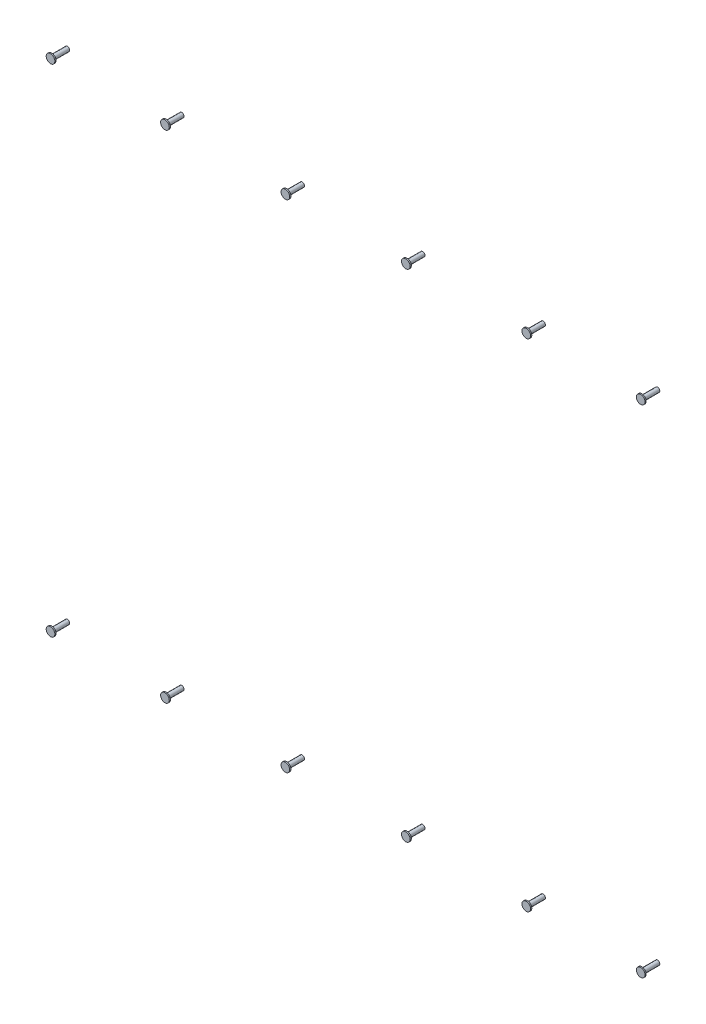
ISO-10303-21;
HEADER;
FILE_DESCRIPTION(('STEP AP214'),'2;1');
FILE_NAME('part.step','',(''),(''),'','','');
FILE_SCHEMA(('AUTOMOTIVE_DESIGN { 1 0 10303 214 1 1 1 1 }'));
ENDSEC;
DATA;
#1=APPLICATION_CONTEXT('core data for automotive mechanical design processes');
#2=APPLICATION_PROTOCOL_DEFINITION('international standard','automotive_design',2000,#1);
#3=PRODUCT_CONTEXT('',#1,'mechanical');
#4=PRODUCT('Part','Part','',(#3));
#5=PRODUCT_RELATED_PRODUCT_CATEGORY('part','',(#4));
#6=PRODUCT_DEFINITION_FORMATION('','',#4);
#7=PRODUCT_DEFINITION_CONTEXT('part definition',#1,'design');
#8=PRODUCT_DEFINITION('design','',#6,#7);
#9=PRODUCT_DEFINITION_SHAPE('','',#8);
#10=(LENGTH_UNIT() NAMED_UNIT(*) SI_UNIT(.MILLI.,.METRE.));
#11=(NAMED_UNIT(*) PLANE_ANGLE_UNIT() SI_UNIT($,.RADIAN.));
#12=(NAMED_UNIT(*) SI_UNIT($,.STERADIAN.) SOLID_ANGLE_UNIT());
#13=UNCERTAINTY_MEASURE_WITH_UNIT(LENGTH_MEASURE(1.E-05),#10,'distance_accuracy_value','');
#14=(GEOMETRIC_REPRESENTATION_CONTEXT(3) GLOBAL_UNCERTAINTY_ASSIGNED_CONTEXT((#13)) GLOBAL_UNIT_ASSIGNED_CONTEXT((#10,
#11,#12)) REPRESENTATION_CONTEXT('',''));
#15=CARTESIAN_POINT('',(0.,0.,0.));
#16=DIRECTION('',(0.,0.,1.));
#17=DIRECTION('',(1.,0.,0.));
#18=AXIS2_PLACEMENT_3D('',#15,#16,#17);
#19=CARTESIAN_POINT('',(-245.,-206.,97.));
#20=DIRECTION('',(0.,0.,-1.));
#21=DIRECTION('',(-1.,0.,0.));
#22=AXIS2_PLACEMENT_3D('',#19,#20,#21);
#23=PLANE('',#22);
#24=CARTESIAN_POINT('',(-245.,-206.,97.));
#25=DIRECTION('',(0.,0.,1.));
#26=DIRECTION('',(1.,0.,0.));
#27=AXIS2_PLACEMENT_3D('',#24,#25,#26);
#28=CIRCLE('',#27,1.9);
#29=CARTESIAN_POINT('',(-243.1,-206.,97.));
#30=VERTEX_POINT('',#29);
#31=EDGE_CURVE('P0_E10',#30,#30,#28,.T.);
#32=ORIENTED_EDGE('',*,*,#31,.F.);
#33=EDGE_LOOP('',(#32));
#34=FACE_BOUND('',#33,.T.);
#35=ADVANCED_FACE('P0_F15',(#34),#23,.T.);
#36=CARTESIAN_POINT('',(-245.,-206.,110.));
#37=DIRECTION('',(0.,0.,-1.));
#38=DIRECTION('',(-1.,0.,0.));
#39=AXIS2_PLACEMENT_3D('',#36,#37,#38);
#40=CYLINDRICAL_SURFACE('',#39,1.9);
#41=ORIENTED_EDGE('',*,*,#31,.T.);
#42=EDGE_LOOP('',(#41));
#43=FACE_BOUND('',#42,.T.);
#44=CARTESIAN_POINT('',(-245.,-206.,110.));
#45=DIRECTION('',(0.,0.,-1.));
#46=DIRECTION('',(-1.,0.,0.));
#47=AXIS2_PLACEMENT_3D('',#44,#45,#46);
#48=CIRCLE('',#47,1.9);
#49=CARTESIAN_POINT('',(-246.9,-206.,110.));
#50=VERTEX_POINT('',#49);
#51=EDGE_CURVE('P0_E23',#50,#50,#48,.F.);
#52=ORIENTED_EDGE('',*,*,#51,.F.);
#53=EDGE_LOOP('',(#52));
#54=FACE_BOUND('',#53,.T.);
#55=ADVANCED_FACE('P0_F17',(#43,#54),#40,.T.);
#56=CARTESIAN_POINT('',(-245.,-206.,111.));
#57=DIRECTION('',(0.,0.,1.));
#58=DIRECTION('',(1.,0.,0.));
#59=AXIS2_PLACEMENT_3D('',#56,#57,#58);
#60=PLANE('',#59);
#61=CARTESIAN_POINT('',(-245.,-206.,111.));
#62=DIRECTION('',(0.,0.,-1.));
#63=DIRECTION('',(-1.,0.,0.));
#64=AXIS2_PLACEMENT_3D('',#61,#62,#63);
#65=CIRCLE('',#64,3.6);
#66=CARTESIAN_POINT('',(-248.6,-206.,111.));
#67=VERTEX_POINT('',#66);
#68=EDGE_CURVE('P0_E30',#67,#67,#65,.T.);
#69=ORIENTED_EDGE('',*,*,#68,.F.);
#70=EDGE_LOOP('',(#69));
#71=FACE_BOUND('',#70,.T.);
#72=ADVANCED_FACE('P0_F45',(#71),#60,.T.);
#73=CARTESIAN_POINT('',(-245.,-206.,110.));
#74=DIRECTION('',(0.,0.,-1.));
#75=DIRECTION('',(-1.,0.,0.));
#76=AXIS2_PLACEMENT_3D('',#73,#74,#75);
#77=PLANE('',#76);
#78=ORIENTED_EDGE('',*,*,#51,.T.);
#79=EDGE_LOOP('',(#78));
#80=FACE_BOUND('',#79,.T.);
#81=CARTESIAN_POINT('',(-245.,-206.,110.));
#82=DIRECTION('',(0.,0.,1.));
#83=DIRECTION('',(1.,0.,0.));
#84=AXIS2_PLACEMENT_3D('',#81,#82,#83);
#85=CIRCLE('',#84,3.6);
#86=CARTESIAN_POINT('',(-241.4,-206.,110.));
#87=VERTEX_POINT('',#86);
#88=EDGE_CURVE('P0_E35',#87,#87,#85,.T.);
#89=ORIENTED_EDGE('',*,*,#88,.F.);
#90=EDGE_LOOP('',(#89));
#91=FACE_BOUND('',#90,.T.);
#92=ADVANCED_FACE('P0_F43',(#80,#91),#77,.T.);
#93=CARTESIAN_POINT('',(-245.,-206.,110.));
#94=DIRECTION('',(0.,0.,1.));
#95=DIRECTION('',(1.,0.,0.));
#96=AXIS2_PLACEMENT_3D('',#93,#94,#95);
#97=CYLINDRICAL_SURFACE('',#96,3.6);
#98=ORIENTED_EDGE('',*,*,#68,.T.);
#99=EDGE_LOOP('',(#98));
#100=FACE_BOUND('',#99,.T.);
#101=ORIENTED_EDGE('',*,*,#88,.T.);
#102=EDGE_LOOP('',(#101));
#103=FACE_BOUND('',#102,.T.);
#104=ADVANCED_FACE('P0_F41',(#100,#103),#97,.T.);
#105=CLOSED_SHELL('',(#35,#55,#72,#92,#104));
#106=MANIFOLD_SOLID_BREP('P0_B1',#105);
#107=CARTESIAN_POINT('',(150.,206.,97.));
#108=DIRECTION('',(0.,0.,-1.));
#109=DIRECTION('',(-1.,0.,0.));
#110=AXIS2_PLACEMENT_3D('',#107,#108,#109);
#111=PLANE('',#110);
#112=CARTESIAN_POINT('',(150.,206.,97.));
#113=DIRECTION('',(0.,0.,1.));
#114=DIRECTION('',(1.,0.,0.));
#115=AXIS2_PLACEMENT_3D('',#112,#113,#114);
#116=CIRCLE('',#115,1.9);
#117=CARTESIAN_POINT('',(151.9,206.,97.));
#118=VERTEX_POINT('',#117);
#119=EDGE_CURVE('P1_E10',#118,#118,#116,.T.);
#120=ORIENTED_EDGE('',*,*,#119,.F.);
#121=EDGE_LOOP('',(#120));
#122=FACE_BOUND('',#121,.T.);
#123=ADVANCED_FACE('P1_F15',(#122),#111,.T.);
#124=CARTESIAN_POINT('',(150.,206.,110.));
#125=DIRECTION('',(0.,0.,-1.));
#126=DIRECTION('',(-1.,0.,0.));
#127=AXIS2_PLACEMENT_3D('',#124,#125,#126);
#128=CYLINDRICAL_SURFACE('',#127,1.9);
#129=ORIENTED_EDGE('',*,*,#119,.T.);
#130=EDGE_LOOP('',(#129));
#131=FACE_BOUND('',#130,.T.);
#132=CARTESIAN_POINT('',(150.,206.,110.));
#133=DIRECTION('',(0.,0.,-1.));
#134=DIRECTION('',(-1.,0.,0.));
#135=AXIS2_PLACEMENT_3D('',#132,#133,#134);
#136=CIRCLE('',#135,1.9);
#137=CARTESIAN_POINT('',(148.1,206.,110.));
#138=VERTEX_POINT('',#137);
#139=EDGE_CURVE('P1_E23',#138,#138,#136,.F.);
#140=ORIENTED_EDGE('',*,*,#139,.F.);
#141=EDGE_LOOP('',(#140));
#142=FACE_BOUND('',#141,.T.);
#143=ADVANCED_FACE('P1_F17',(#131,#142),#128,.T.);
#144=CARTESIAN_POINT('',(150.,206.,111.));
#145=DIRECTION('',(0.,0.,1.));
#146=DIRECTION('',(1.,0.,0.));
#147=AXIS2_PLACEMENT_3D('',#144,#145,#146);
#148=PLANE('',#147);
#149=CARTESIAN_POINT('',(150.,206.,111.));
#150=DIRECTION('',(0.,0.,-1.));
#151=DIRECTION('',(-1.,0.,0.));
#152=AXIS2_PLACEMENT_3D('',#149,#150,#151);
#153=CIRCLE('',#152,3.6);
#154=CARTESIAN_POINT('',(146.4,206.,111.));
#155=VERTEX_POINT('',#154);
#156=EDGE_CURVE('P1_E30',#155,#155,#153,.T.);
#157=ORIENTED_EDGE('',*,*,#156,.F.);
#158=EDGE_LOOP('',(#157));
#159=FACE_BOUND('',#158,.T.);
#160=ADVANCED_FACE('P1_F45',(#159),#148,.T.);
#161=CARTESIAN_POINT('',(150.,206.,110.));
#162=DIRECTION('',(0.,0.,-1.));
#163=DIRECTION('',(-1.,0.,0.));
#164=AXIS2_PLACEMENT_3D('',#161,#162,#163);
#165=PLANE('',#164);
#166=ORIENTED_EDGE('',*,*,#139,.T.);
#167=EDGE_LOOP('',(#166));
#168=FACE_BOUND('',#167,.T.);
#169=CARTESIAN_POINT('',(150.,206.,110.));
#170=DIRECTION('',(0.,0.,1.));
#171=DIRECTION('',(1.,0.,0.));
#172=AXIS2_PLACEMENT_3D('',#169,#170,#171);
#173=CIRCLE('',#172,3.6);
#174=CARTESIAN_POINT('',(153.6,206.,110.));
#175=VERTEX_POINT('',#174);
#176=EDGE_CURVE('P1_E34',#175,#175,#173,.T.);
#177=ORIENTED_EDGE('',*,*,#176,.F.);
#178=EDGE_LOOP('',(#177));
#179=FACE_BOUND('',#178,.T.);
#180=ADVANCED_FACE('P1_F43',(#168,#179),#165,.T.);
#181=CARTESIAN_POINT('',(150.,206.,110.));
#182=DIRECTION('',(0.,0.,1.));
#183=DIRECTION('',(1.,0.,0.));
#184=AXIS2_PLACEMENT_3D('',#181,#182,#183);
#185=CYLINDRICAL_SURFACE('',#184,3.6);
#186=ORIENTED_EDGE('',*,*,#156,.T.);
#187=EDGE_LOOP('',(#186));
#188=FACE_BOUND('',#187,.T.);
#189=ORIENTED_EDGE('',*,*,#176,.T.);
#190=EDGE_LOOP('',(#189));
#191=FACE_BOUND('',#190,.T.);
#192=ADVANCED_FACE('P1_F41',(#188,#191),#185,.T.);
#193=CLOSED_SHELL('',(#123,#143,#160,#180,#192));
#194=MANIFOLD_SOLID_BREP('P1_B1',#193);
#195=CARTESIAN_POINT('',(245.,-206.,97.));
#196=DIRECTION('',(0.,0.,-1.));
#197=DIRECTION('',(-1.,0.,0.));
#198=AXIS2_PLACEMENT_3D('',#195,#196,#197);
#199=PLANE('',#198);
#200=CARTESIAN_POINT('',(245.,-206.,97.));
#201=DIRECTION('',(0.,0.,1.));
#202=DIRECTION('',(1.,0.,0.));
#203=AXIS2_PLACEMENT_3D('',#200,#201,#202);
#204=CIRCLE('',#203,1.9);
#205=CARTESIAN_POINT('',(246.9,-206.,97.));
#206=VERTEX_POINT('',#205);
#207=EDGE_CURVE('P2_E10',#206,#206,#204,.T.);
#208=ORIENTED_EDGE('',*,*,#207,.F.);
#209=EDGE_LOOP('',(#208));
#210=FACE_BOUND('',#209,.T.);
#211=ADVANCED_FACE('P2_F15',(#210),#199,.T.);
#212=CARTESIAN_POINT('',(245.,-206.,110.));
#213=DIRECTION('',(0.,0.,-1.));
#214=DIRECTION('',(-1.,0.,0.));
#215=AXIS2_PLACEMENT_3D('',#212,#213,#214);
#216=CYLINDRICAL_SURFACE('',#215,1.9);
#217=ORIENTED_EDGE('',*,*,#207,.T.);
#218=EDGE_LOOP('',(#217));
#219=FACE_BOUND('',#218,.T.);
#220=CARTESIAN_POINT('',(245.,-206.,110.));
#221=DIRECTION('',(0.,0.,-1.));
#222=DIRECTION('',(-1.,0.,0.));
#223=AXIS2_PLACEMENT_3D('',#220,#221,#222);
#224=CIRCLE('',#223,1.9);
#225=CARTESIAN_POINT('',(243.1,-206.,110.));
#226=VERTEX_POINT('',#225);
#227=EDGE_CURVE('P2_E23',#226,#226,#224,.F.);
#228=ORIENTED_EDGE('',*,*,#227,.F.);
#229=EDGE_LOOP('',(#228));
#230=FACE_BOUND('',#229,.T.);
#231=ADVANCED_FACE('P2_F17',(#219,#230),#216,.T.);
#232=CARTESIAN_POINT('',(245.,-206.,111.));
#233=DIRECTION('',(0.,0.,1.));
#234=DIRECTION('',(1.,0.,0.));
#235=AXIS2_PLACEMENT_3D('',#232,#233,#234);
#236=PLANE('',#235);
#237=CARTESIAN_POINT('',(245.,-206.,111.));
#238=DIRECTION('',(0.,0.,-1.));
#239=DIRECTION('',(-1.,0.,0.));
#240=AXIS2_PLACEMENT_3D('',#237,#238,#239);
#241=CIRCLE('',#240,3.6);
#242=CARTESIAN_POINT('',(241.4,-206.,111.));
#243=VERTEX_POINT('',#242);
#244=EDGE_CURVE('P2_E30',#243,#243,#241,.T.);
#245=ORIENTED_EDGE('',*,*,#244,.F.);
#246=EDGE_LOOP('',(#245));
#247=FACE_BOUND('',#246,.T.);
#248=ADVANCED_FACE('P2_F45',(#247),#236,.T.);
#249=CARTESIAN_POINT('',(245.,-206.,110.));
#250=DIRECTION('',(0.,0.,-1.));
#251=DIRECTION('',(-1.,0.,0.));
#252=AXIS2_PLACEMENT_3D('',#249,#250,#251);
#253=PLANE('',#252);
#254=ORIENTED_EDGE('',*,*,#227,.T.);
#255=EDGE_LOOP('',(#254));
#256=FACE_BOUND('',#255,.T.);
#257=CARTESIAN_POINT('',(245.,-206.,110.));
#258=DIRECTION('',(0.,0.,1.));
#259=DIRECTION('',(1.,0.,0.));
#260=AXIS2_PLACEMENT_3D('',#257,#258,#259);
#261=CIRCLE('',#260,3.6);
#262=CARTESIAN_POINT('',(248.6,-206.,110.));
#263=VERTEX_POINT('',#262);
#264=EDGE_CURVE('P2_E35',#263,#263,#261,.T.);
#265=ORIENTED_EDGE('',*,*,#264,.F.);
#266=EDGE_LOOP('',(#265));
#267=FACE_BOUND('',#266,.T.);
#268=ADVANCED_FACE('P2_F43',(#256,#267),#253,.T.);
#269=CARTESIAN_POINT('',(245.,-206.,110.));
#270=DIRECTION('',(0.,0.,1.));
#271=DIRECTION('',(1.,0.,0.));
#272=AXIS2_PLACEMENT_3D('',#269,#270,#271);
#273=CYLINDRICAL_SURFACE('',#272,3.6);
#274=ORIENTED_EDGE('',*,*,#244,.T.);
#275=EDGE_LOOP('',(#274));
#276=FACE_BOUND('',#275,.T.);
#277=ORIENTED_EDGE('',*,*,#264,.T.);
#278=EDGE_LOOP('',(#277));
#279=FACE_BOUND('',#278,.T.);
#280=ADVANCED_FACE('P2_F41',(#276,#279),#273,.T.);
#281=CLOSED_SHELL('',(#211,#231,#248,#268,#280));
#282=MANIFOLD_SOLID_BREP('P2_B1',#281);
#283=CARTESIAN_POINT('',(245.,206.,97.));
#284=DIRECTION('',(0.,0.,-1.));
#285=DIRECTION('',(-1.,0.,0.));
#286=AXIS2_PLACEMENT_3D('',#283,#284,#285);
#287=PLANE('',#286);
#288=CARTESIAN_POINT('',(245.,206.,97.));
#289=DIRECTION('',(0.,0.,1.));
#290=DIRECTION('',(1.,0.,0.));
#291=AXIS2_PLACEMENT_3D('',#288,#289,#290);
#292=CIRCLE('',#291,1.9);
#293=CARTESIAN_POINT('',(246.9,206.,97.));
#294=VERTEX_POINT('',#293);
#295=EDGE_CURVE('P3_E10',#294,#294,#292,.T.);
#296=ORIENTED_EDGE('',*,*,#295,.F.);
#297=EDGE_LOOP('',(#296));
#298=FACE_BOUND('',#297,.T.);
#299=ADVANCED_FACE('P3_F15',(#298),#287,.T.);
#300=CARTESIAN_POINT('',(245.,206.,110.));
#301=DIRECTION('',(0.,0.,-1.));
#302=DIRECTION('',(-1.,0.,0.));
#303=AXIS2_PLACEMENT_3D('',#300,#301,#302);
#304=CYLINDRICAL_SURFACE('',#303,1.9);
#305=ORIENTED_EDGE('',*,*,#295,.T.);
#306=EDGE_LOOP('',(#305));
#307=FACE_BOUND('',#306,.T.);
#308=CARTESIAN_POINT('',(245.,206.,110.));
#309=DIRECTION('',(0.,0.,-1.));
#310=DIRECTION('',(-1.,0.,0.));
#311=AXIS2_PLACEMENT_3D('',#308,#309,#310);
#312=CIRCLE('',#311,1.9);
#313=CARTESIAN_POINT('',(243.1,206.,110.));
#314=VERTEX_POINT('',#313);
#315=EDGE_CURVE('P3_E23',#314,#314,#312,.F.);
#316=ORIENTED_EDGE('',*,*,#315,.F.);
#317=EDGE_LOOP('',(#316));
#318=FACE_BOUND('',#317,.T.);
#319=ADVANCED_FACE('P3_F17',(#307,#318),#304,.T.);
#320=CARTESIAN_POINT('',(245.,206.,111.));
#321=DIRECTION('',(0.,0.,1.));
#322=DIRECTION('',(1.,0.,0.));
#323=AXIS2_PLACEMENT_3D('',#320,#321,#322);
#324=PLANE('',#323);
#325=CARTESIAN_POINT('',(245.,206.,111.));
#326=DIRECTION('',(0.,0.,-1.));
#327=DIRECTION('',(-1.,0.,0.));
#328=AXIS2_PLACEMENT_3D('',#325,#326,#327);
#329=CIRCLE('',#328,3.6);
#330=CARTESIAN_POINT('',(241.4,206.,111.));
#331=VERTEX_POINT('',#330);
#332=EDGE_CURVE('P3_E29',#331,#331,#329,.T.);
#333=ORIENTED_EDGE('',*,*,#332,.F.);
#334=EDGE_LOOP('',(#333));
#335=FACE_BOUND('',#334,.T.);
#336=ADVANCED_FACE('P3_F45',(#335),#324,.T.);
#337=CARTESIAN_POINT('',(245.,206.,110.));
#338=DIRECTION('',(0.,0.,-1.));
#339=DIRECTION('',(-1.,0.,0.));
#340=AXIS2_PLACEMENT_3D('',#337,#338,#339);
#341=PLANE('',#340);
#342=ORIENTED_EDGE('',*,*,#315,.T.);
#343=EDGE_LOOP('',(#342));
#344=FACE_BOUND('',#343,.T.);
#345=CARTESIAN_POINT('',(245.,206.,110.));
#346=DIRECTION('',(0.,0.,1.));
#347=DIRECTION('',(1.,0.,0.));
#348=AXIS2_PLACEMENT_3D('',#345,#346,#347);
#349=CIRCLE('',#348,3.6);
#350=CARTESIAN_POINT('',(248.6,206.,110.));
#351=VERTEX_POINT('',#350);
#352=EDGE_CURVE('P3_E34',#351,#351,#349,.T.);
#353=ORIENTED_EDGE('',*,*,#352,.F.);
#354=EDGE_LOOP('',(#353));
#355=FACE_BOUND('',#354,.T.);
#356=ADVANCED_FACE('P3_F43',(#344,#355),#341,.T.);
#357=CARTESIAN_POINT('',(245.,206.,110.));
#358=DIRECTION('',(0.,0.,1.));
#359=DIRECTION('',(1.,0.,0.));
#360=AXIS2_PLACEMENT_3D('',#357,#358,#359);
#361=CYLINDRICAL_SURFACE('',#360,3.6);
#362=ORIENTED_EDGE('',*,*,#332,.T.);
#363=EDGE_LOOP('',(#362));
#364=FACE_BOUND('',#363,.T.);
#365=ORIENTED_EDGE('',*,*,#352,.T.);
#366=EDGE_LOOP('',(#365));
#367=FACE_BOUND('',#366,.T.);
#368=ADVANCED_FACE('P3_F41',(#364,#367),#361,.T.);
#369=CLOSED_SHELL('',(#299,#319,#336,#356,#368));
#370=MANIFOLD_SOLID_BREP('P3_B1',#369);
#371=CARTESIAN_POINT('',(-245.,206.,97.));
#372=DIRECTION('',(0.,0.,-1.));
#373=DIRECTION('',(-1.,0.,0.));
#374=AXIS2_PLACEMENT_3D('',#371,#372,#373);
#375=PLANE('',#374);
#376=CARTESIAN_POINT('',(-245.,206.,97.));
#377=DIRECTION('',(0.,0.,1.));
#378=DIRECTION('',(1.,0.,0.));
#379=AXIS2_PLACEMENT_3D('',#376,#377,#378);
#380=CIRCLE('',#379,1.9);
#381=CARTESIAN_POINT('',(-243.1,206.,97.));
#382=VERTEX_POINT('',#381);
#383=EDGE_CURVE('P4_E10',#382,#382,#380,.T.);
#384=ORIENTED_EDGE('',*,*,#383,.F.);
#385=EDGE_LOOP('',(#384));
#386=FACE_BOUND('',#385,.T.);
#387=ADVANCED_FACE('P4_F15',(#386),#375,.T.);
#388=CARTESIAN_POINT('',(-245.,206.,110.));
#389=DIRECTION('',(0.,0.,-1.));
#390=DIRECTION('',(-1.,0.,0.));
#391=AXIS2_PLACEMENT_3D('',#388,#389,#390);
#392=CYLINDRICAL_SURFACE('',#391,1.9);
#393=ORIENTED_EDGE('',*,*,#383,.T.);
#394=EDGE_LOOP('',(#393));
#395=FACE_BOUND('',#394,.T.);
#396=CARTESIAN_POINT('',(-245.,206.,110.));
#397=DIRECTION('',(0.,0.,-1.));
#398=DIRECTION('',(-1.,0.,0.));
#399=AXIS2_PLACEMENT_3D('',#396,#397,#398);
#400=CIRCLE('',#399,1.9);
#401=CARTESIAN_POINT('',(-246.9,206.,110.));
#402=VERTEX_POINT('',#401);
#403=EDGE_CURVE('P4_E23',#402,#402,#400,.F.);
#404=ORIENTED_EDGE('',*,*,#403,.F.);
#405=EDGE_LOOP('',(#404));
#406=FACE_BOUND('',#405,.T.);
#407=ADVANCED_FACE('P4_F17',(#395,#406),#392,.T.);
#408=CARTESIAN_POINT('',(-245.,206.,111.));
#409=DIRECTION('',(0.,0.,1.));
#410=DIRECTION('',(1.,0.,0.));
#411=AXIS2_PLACEMENT_3D('',#408,#409,#410);
#412=PLANE('',#411);
#413=CARTESIAN_POINT('',(-245.,206.,111.));
#414=DIRECTION('',(0.,0.,-1.));
#415=DIRECTION('',(-1.,0.,0.));
#416=AXIS2_PLACEMENT_3D('',#413,#414,#415);
#417=CIRCLE('',#416,3.6);
#418=CARTESIAN_POINT('',(-248.6,206.,111.));
#419=VERTEX_POINT('',#418);
#420=EDGE_CURVE('P4_E30',#419,#419,#417,.T.);
#421=ORIENTED_EDGE('',*,*,#420,.F.);
#422=EDGE_LOOP('',(#421));
#423=FACE_BOUND('',#422,.T.);
#424=ADVANCED_FACE('P4_F45',(#423),#412,.T.);
#425=CARTESIAN_POINT('',(-245.,206.,110.));
#426=DIRECTION('',(0.,0.,-1.));
#427=DIRECTION('',(-1.,0.,0.));
#428=AXIS2_PLACEMENT_3D('',#425,#426,#427);
#429=PLANE('',#428);
#430=ORIENTED_EDGE('',*,*,#403,.T.);
#431=EDGE_LOOP('',(#430));
#432=FACE_BOUND('',#431,.T.);
#433=CARTESIAN_POINT('',(-245.,206.,110.));
#434=DIRECTION('',(0.,0.,1.));
#435=DIRECTION('',(1.,0.,0.));
#436=AXIS2_PLACEMENT_3D('',#433,#434,#435);
#437=CIRCLE('',#436,3.6);
#438=CARTESIAN_POINT('',(-241.4,206.,110.));
#439=VERTEX_POINT('',#438);
#440=EDGE_CURVE('P4_E35',#439,#439,#437,.T.);
#441=ORIENTED_EDGE('',*,*,#440,.F.);
#442=EDGE_LOOP('',(#441));
#443=FACE_BOUND('',#442,.T.);
#444=ADVANCED_FACE('P4_F43',(#432,#443),#429,.T.);
#445=CARTESIAN_POINT('',(-245.,206.,110.));
#446=DIRECTION('',(0.,0.,1.));
#447=DIRECTION('',(1.,0.,0.));
#448=AXIS2_PLACEMENT_3D('',#445,#446,#447);
#449=CYLINDRICAL_SURFACE('',#448,3.6);
#450=ORIENTED_EDGE('',*,*,#420,.T.);
#451=EDGE_LOOP('',(#450));
#452=FACE_BOUND('',#451,.T.);
#453=ORIENTED_EDGE('',*,*,#440,.T.);
#454=EDGE_LOOP('',(#453));
#455=FACE_BOUND('',#454,.T.);
#456=ADVANCED_FACE('P4_F41',(#452,#455),#449,.T.);
#457=CLOSED_SHELL('',(#387,#407,#424,#444,#456));
#458=MANIFOLD_SOLID_BREP('P4_B1',#457);
#459=CARTESIAN_POINT('',(-150.,-206.,97.));
#460=DIRECTION('',(0.,0.,-1.));
#461=DIRECTION('',(-1.,0.,0.));
#462=AXIS2_PLACEMENT_3D('',#459,#460,#461);
#463=PLANE('',#462);
#464=CARTESIAN_POINT('',(-150.,-206.,97.));
#465=DIRECTION('',(0.,0.,1.));
#466=DIRECTION('',(1.,0.,0.));
#467=AXIS2_PLACEMENT_3D('',#464,#465,#466);
#468=CIRCLE('',#467,1.9);
#469=CARTESIAN_POINT('',(-148.1,-206.,97.));
#470=VERTEX_POINT('',#469);
#471=EDGE_CURVE('P5_E10',#470,#470,#468,.T.);
#472=ORIENTED_EDGE('',*,*,#471,.F.);
#473=EDGE_LOOP('',(#472));
#474=FACE_BOUND('',#473,.T.);
#475=ADVANCED_FACE('P5_F15',(#474),#463,.T.);
#476=CARTESIAN_POINT('',(-150.,-206.,110.));
#477=DIRECTION('',(0.,0.,-1.));
#478=DIRECTION('',(-1.,0.,0.));
#479=AXIS2_PLACEMENT_3D('',#476,#477,#478);
#480=CYLINDRICAL_SURFACE('',#479,1.9);
#481=ORIENTED_EDGE('',*,*,#471,.T.);
#482=EDGE_LOOP('',(#481));
#483=FACE_BOUND('',#482,.T.);
#484=CARTESIAN_POINT('',(-150.,-206.,110.));
#485=DIRECTION('',(0.,0.,-1.));
#486=DIRECTION('',(-1.,0.,0.));
#487=AXIS2_PLACEMENT_3D('',#484,#485,#486);
#488=CIRCLE('',#487,1.9);
#489=CARTESIAN_POINT('',(-151.9,-206.,110.));
#490=VERTEX_POINT('',#489);
#491=EDGE_CURVE('P5_E23',#490,#490,#488,.F.);
#492=ORIENTED_EDGE('',*,*,#491,.F.);
#493=EDGE_LOOP('',(#492));
#494=FACE_BOUND('',#493,.T.);
#495=ADVANCED_FACE('P5_F17',(#483,#494),#480,.T.);
#496=CARTESIAN_POINT('',(-150.,-206.,111.));
#497=DIRECTION('',(0.,0.,1.));
#498=DIRECTION('',(1.,0.,0.));
#499=AXIS2_PLACEMENT_3D('',#496,#497,#498);
#500=PLANE('',#499);
#501=CARTESIAN_POINT('',(-150.,-206.,111.));
#502=DIRECTION('',(0.,0.,-1.));
#503=DIRECTION('',(-1.,0.,0.));
#504=AXIS2_PLACEMENT_3D('',#501,#502,#503);
#505=CIRCLE('',#504,3.6);
#506=CARTESIAN_POINT('',(-153.6,-206.,111.));
#507=VERTEX_POINT('',#506);
#508=EDGE_CURVE('P5_E30',#507,#507,#505,.T.);
#509=ORIENTED_EDGE('',*,*,#508,.F.);
#510=EDGE_LOOP('',(#509));
#511=FACE_BOUND('',#510,.T.);
#512=ADVANCED_FACE('P5_F45',(#511),#500,.T.);
#513=CARTESIAN_POINT('',(-150.,-206.,110.));
#514=DIRECTION('',(0.,0.,-1.));
#515=DIRECTION('',(-1.,0.,0.));
#516=AXIS2_PLACEMENT_3D('',#513,#514,#515);
#517=PLANE('',#516);
#518=ORIENTED_EDGE('',*,*,#491,.T.);
#519=EDGE_LOOP('',(#518));
#520=FACE_BOUND('',#519,.T.);
#521=CARTESIAN_POINT('',(-150.,-206.,110.));
#522=DIRECTION('',(0.,0.,1.));
#523=DIRECTION('',(1.,0.,0.));
#524=AXIS2_PLACEMENT_3D('',#521,#522,#523);
#525=CIRCLE('',#524,3.6);
#526=CARTESIAN_POINT('',(-146.4,-206.,110.));
#527=VERTEX_POINT('',#526);
#528=EDGE_CURVE('P5_E35',#527,#527,#525,.T.);
#529=ORIENTED_EDGE('',*,*,#528,.F.);
#530=EDGE_LOOP('',(#529));
#531=FACE_BOUND('',#530,.T.);
#532=ADVANCED_FACE('P5_F43',(#520,#531),#517,.T.);
#533=CARTESIAN_POINT('',(-150.,-206.,110.));
#534=DIRECTION('',(0.,0.,1.));
#535=DIRECTION('',(1.,0.,0.));
#536=AXIS2_PLACEMENT_3D('',#533,#534,#535);
#537=CYLINDRICAL_SURFACE('',#536,3.6);
#538=ORIENTED_EDGE('',*,*,#508,.T.);
#539=EDGE_LOOP('',(#538));
#540=FACE_BOUND('',#539,.T.);
#541=ORIENTED_EDGE('',*,*,#528,.T.);
#542=EDGE_LOOP('',(#541));
#543=FACE_BOUND('',#542,.T.);
#544=ADVANCED_FACE('P5_F41',(#540,#543),#537,.T.);
#545=CLOSED_SHELL('',(#475,#495,#512,#532,#544));
#546=MANIFOLD_SOLID_BREP('P5_B1',#545);
#547=CARTESIAN_POINT('',(-150.,206.,97.));
#548=DIRECTION('',(0.,0.,-1.));
#549=DIRECTION('',(-1.,0.,0.));
#550=AXIS2_PLACEMENT_3D('',#547,#548,#549);
#551=PLANE('',#550);
#552=CARTESIAN_POINT('',(-150.,206.,97.));
#553=DIRECTION('',(0.,0.,1.));
#554=DIRECTION('',(1.,0.,0.));
#555=AXIS2_PLACEMENT_3D('',#552,#553,#554);
#556=CIRCLE('',#555,1.9);
#557=CARTESIAN_POINT('',(-148.1,206.,97.));
#558=VERTEX_POINT('',#557);
#559=EDGE_CURVE('P6_E10',#558,#558,#556,.T.);
#560=ORIENTED_EDGE('',*,*,#559,.F.);
#561=EDGE_LOOP('',(#560));
#562=FACE_BOUND('',#561,.T.);
#563=ADVANCED_FACE('P6_F15',(#562),#551,.T.);
#564=CARTESIAN_POINT('',(-150.,206.,110.));
#565=DIRECTION('',(0.,0.,-1.));
#566=DIRECTION('',(-1.,0.,0.));
#567=AXIS2_PLACEMENT_3D('',#564,#565,#566);
#568=CYLINDRICAL_SURFACE('',#567,1.9);
#569=ORIENTED_EDGE('',*,*,#559,.T.);
#570=EDGE_LOOP('',(#569));
#571=FACE_BOUND('',#570,.T.);
#572=CARTESIAN_POINT('',(-150.,206.,110.));
#573=DIRECTION('',(0.,0.,-1.));
#574=DIRECTION('',(-1.,0.,0.));
#575=AXIS2_PLACEMENT_3D('',#572,#573,#574);
#576=CIRCLE('',#575,1.9);
#577=CARTESIAN_POINT('',(-151.9,206.,110.));
#578=VERTEX_POINT('',#577);
#579=EDGE_CURVE('P6_E23',#578,#578,#576,.F.);
#580=ORIENTED_EDGE('',*,*,#579,.F.);
#581=EDGE_LOOP('',(#580));
#582=FACE_BOUND('',#581,.T.);
#583=ADVANCED_FACE('P6_F17',(#571,#582),#568,.T.);
#584=CARTESIAN_POINT('',(-150.,206.,111.));
#585=DIRECTION('',(0.,0.,1.));
#586=DIRECTION('',(1.,0.,0.));
#587=AXIS2_PLACEMENT_3D('',#584,#585,#586);
#588=PLANE('',#587);
#589=CARTESIAN_POINT('',(-150.,206.,111.));
#590=DIRECTION('',(0.,0.,-1.));
#591=DIRECTION('',(-1.,0.,0.));
#592=AXIS2_PLACEMENT_3D('',#589,#590,#591);
#593=CIRCLE('',#592,3.6);
#594=CARTESIAN_POINT('',(-153.6,206.,111.));
#595=VERTEX_POINT('',#594);
#596=EDGE_CURVE('P6_E29',#595,#595,#593,.T.);
#597=ORIENTED_EDGE('',*,*,#596,.F.);
#598=EDGE_LOOP('',(#597));
#599=FACE_BOUND('',#598,.T.);
#600=ADVANCED_FACE('P6_F45',(#599),#588,.T.);
#601=CARTESIAN_POINT('',(-150.,206.,110.));
#602=DIRECTION('',(0.,0.,-1.));
#603=DIRECTION('',(-1.,0.,0.));
#604=AXIS2_PLACEMENT_3D('',#601,#602,#603);
#605=PLANE('',#604);
#606=ORIENTED_EDGE('',*,*,#579,.T.);
#607=EDGE_LOOP('',(#606));
#608=FACE_BOUND('',#607,.T.);
#609=CARTESIAN_POINT('',(-150.,206.,110.));
#610=DIRECTION('',(0.,0.,1.));
#611=DIRECTION('',(1.,0.,0.));
#612=AXIS2_PLACEMENT_3D('',#609,#610,#611);
#613=CIRCLE('',#612,3.6);
#614=CARTESIAN_POINT('',(-146.4,206.,110.));
#615=VERTEX_POINT('',#614);
#616=EDGE_CURVE('P6_E35',#615,#615,#613,.T.);
#617=ORIENTED_EDGE('',*,*,#616,.F.);
#618=EDGE_LOOP('',(#617));
#619=FACE_BOUND('',#618,.T.);
#620=ADVANCED_FACE('P6_F43',(#608,#619),#605,.T.);
#621=CARTESIAN_POINT('',(-150.,206.,110.));
#622=DIRECTION('',(0.,0.,1.));
#623=DIRECTION('',(1.,0.,0.));
#624=AXIS2_PLACEMENT_3D('',#621,#622,#623);
#625=CYLINDRICAL_SURFACE('',#624,3.6);
#626=ORIENTED_EDGE('',*,*,#596,.T.);
#627=EDGE_LOOP('',(#626));
#628=FACE_BOUND('',#627,.T.);
#629=ORIENTED_EDGE('',*,*,#616,.T.);
#630=EDGE_LOOP('',(#629));
#631=FACE_BOUND('',#630,.T.);
#632=ADVANCED_FACE('P6_F41',(#628,#631),#625,.T.);
#633=CLOSED_SHELL('',(#563,#583,#600,#620,#632));
#634=MANIFOLD_SOLID_BREP('P6_B1',#633);
#635=CARTESIAN_POINT('',(-50.,-206.,97.));
#636=DIRECTION('',(0.,0.,-1.));
#637=DIRECTION('',(-1.,0.,0.));
#638=AXIS2_PLACEMENT_3D('',#635,#636,#637);
#639=PLANE('',#638);
#640=CARTESIAN_POINT('',(-50.,-206.,97.));
#641=DIRECTION('',(0.,0.,1.));
#642=DIRECTION('',(1.,0.,0.));
#643=AXIS2_PLACEMENT_3D('',#640,#641,#642);
#644=CIRCLE('',#643,1.9);
#645=CARTESIAN_POINT('',(-48.1,-206.,97.));
#646=VERTEX_POINT('',#645);
#647=EDGE_CURVE('P7_E10',#646,#646,#644,.T.);
#648=ORIENTED_EDGE('',*,*,#647,.F.);
#649=EDGE_LOOP('',(#648));
#650=FACE_BOUND('',#649,.T.);
#651=ADVANCED_FACE('P7_F15',(#650),#639,.T.);
#652=CARTESIAN_POINT('',(-50.,-206.,110.));
#653=DIRECTION('',(0.,0.,-1.));
#654=DIRECTION('',(-1.,0.,0.));
#655=AXIS2_PLACEMENT_3D('',#652,#653,#654);
#656=CYLINDRICAL_SURFACE('',#655,1.9);
#657=ORIENTED_EDGE('',*,*,#647,.T.);
#658=EDGE_LOOP('',(#657));
#659=FACE_BOUND('',#658,.T.);
#660=CARTESIAN_POINT('',(-50.,-206.,110.));
#661=DIRECTION('',(0.,0.,-1.));
#662=DIRECTION('',(-1.,0.,0.));
#663=AXIS2_PLACEMENT_3D('',#660,#661,#662);
#664=CIRCLE('',#663,1.9);
#665=CARTESIAN_POINT('',(-51.9,-206.,110.));
#666=VERTEX_POINT('',#665);
#667=EDGE_CURVE('P7_E23',#666,#666,#664,.F.);
#668=ORIENTED_EDGE('',*,*,#667,.F.);
#669=EDGE_LOOP('',(#668));
#670=FACE_BOUND('',#669,.T.);
#671=ADVANCED_FACE('P7_F17',(#659,#670),#656,.T.);
#672=CARTESIAN_POINT('',(-50.,-206.,111.));
#673=DIRECTION('',(0.,0.,1.));
#674=DIRECTION('',(1.,0.,0.));
#675=AXIS2_PLACEMENT_3D('',#672,#673,#674);
#676=PLANE('',#675);
#677=CARTESIAN_POINT('',(-50.,-206.,111.));
#678=DIRECTION('',(0.,0.,-1.));
#679=DIRECTION('',(-1.,0.,0.));
#680=AXIS2_PLACEMENT_3D('',#677,#678,#679);
#681=CIRCLE('',#680,3.6);
#682=CARTESIAN_POINT('',(-53.6,-206.,111.));
#683=VERTEX_POINT('',#682);
#684=EDGE_CURVE('P7_E30',#683,#683,#681,.T.);
#685=ORIENTED_EDGE('',*,*,#684,.F.);
#686=EDGE_LOOP('',(#685));
#687=FACE_BOUND('',#686,.T.);
#688=ADVANCED_FACE('P7_F45',(#687),#676,.T.);
#689=CARTESIAN_POINT('',(-50.,-206.,110.));
#690=DIRECTION('',(0.,0.,-1.));
#691=DIRECTION('',(-1.,0.,0.));
#692=AXIS2_PLACEMENT_3D('',#689,#690,#691);
#693=PLANE('',#692);
#694=ORIENTED_EDGE('',*,*,#667,.T.);
#695=EDGE_LOOP('',(#694));
#696=FACE_BOUND('',#695,.T.);
#697=CARTESIAN_POINT('',(-50.,-206.,110.));
#698=DIRECTION('',(0.,0.,1.));
#699=DIRECTION('',(1.,0.,0.));
#700=AXIS2_PLACEMENT_3D('',#697,#698,#699);
#701=CIRCLE('',#700,3.6);
#702=CARTESIAN_POINT('',(-46.4,-206.,110.));
#703=VERTEX_POINT('',#702);
#704=EDGE_CURVE('P7_E35',#703,#703,#701,.T.);
#705=ORIENTED_EDGE('',*,*,#704,.F.);
#706=EDGE_LOOP('',(#705));
#707=FACE_BOUND('',#706,.T.);
#708=ADVANCED_FACE('P7_F43',(#696,#707),#693,.T.);
#709=CARTESIAN_POINT('',(-50.,-206.,110.));
#710=DIRECTION('',(0.,0.,1.));
#711=DIRECTION('',(1.,0.,0.));
#712=AXIS2_PLACEMENT_3D('',#709,#710,#711);
#713=CYLINDRICAL_SURFACE('',#712,3.6);
#714=ORIENTED_EDGE('',*,*,#684,.T.);
#715=EDGE_LOOP('',(#714));
#716=FACE_BOUND('',#715,.T.);
#717=ORIENTED_EDGE('',*,*,#704,.T.);
#718=EDGE_LOOP('',(#717));
#719=FACE_BOUND('',#718,.T.);
#720=ADVANCED_FACE('P7_F41',(#716,#719),#713,.T.);
#721=CLOSED_SHELL('',(#651,#671,#688,#708,#720));
#722=MANIFOLD_SOLID_BREP('P7_B1',#721);
#723=CARTESIAN_POINT('',(-50.,206.,97.));
#724=DIRECTION('',(0.,0.,-1.));
#725=DIRECTION('',(-1.,0.,0.));
#726=AXIS2_PLACEMENT_3D('',#723,#724,#725);
#727=PLANE('',#726);
#728=CARTESIAN_POINT('',(-50.,206.,97.));
#729=DIRECTION('',(0.,0.,1.));
#730=DIRECTION('',(1.,0.,0.));
#731=AXIS2_PLACEMENT_3D('',#728,#729,#730);
#732=CIRCLE('',#731,1.9);
#733=CARTESIAN_POINT('',(-48.1,206.,97.));
#734=VERTEX_POINT('',#733);
#735=EDGE_CURVE('P8_E10',#734,#734,#732,.T.);
#736=ORIENTED_EDGE('',*,*,#735,.F.);
#737=EDGE_LOOP('',(#736));
#738=FACE_BOUND('',#737,.T.);
#739=ADVANCED_FACE('P8_F15',(#738),#727,.T.);
#740=CARTESIAN_POINT('',(-50.,206.,110.));
#741=DIRECTION('',(0.,0.,-1.));
#742=DIRECTION('',(-1.,0.,0.));
#743=AXIS2_PLACEMENT_3D('',#740,#741,#742);
#744=CYLINDRICAL_SURFACE('',#743,1.9);
#745=ORIENTED_EDGE('',*,*,#735,.T.);
#746=EDGE_LOOP('',(#745));
#747=FACE_BOUND('',#746,.T.);
#748=CARTESIAN_POINT('',(-50.,206.,110.));
#749=DIRECTION('',(0.,0.,-1.));
#750=DIRECTION('',(-1.,0.,0.));
#751=AXIS2_PLACEMENT_3D('',#748,#749,#750);
#752=CIRCLE('',#751,1.9);
#753=CARTESIAN_POINT('',(-51.9,206.,110.));
#754=VERTEX_POINT('',#753);
#755=EDGE_CURVE('P8_E23',#754,#754,#752,.F.);
#756=ORIENTED_EDGE('',*,*,#755,.F.);
#757=EDGE_LOOP('',(#756));
#758=FACE_BOUND('',#757,.T.);
#759=ADVANCED_FACE('P8_F17',(#747,#758),#744,.T.);
#760=CARTESIAN_POINT('',(-50.,206.,111.));
#761=DIRECTION('',(0.,0.,1.));
#762=DIRECTION('',(1.,0.,0.));
#763=AXIS2_PLACEMENT_3D('',#760,#761,#762);
#764=PLANE('',#763);
#765=CARTESIAN_POINT('',(-50.,206.,111.));
#766=DIRECTION('',(0.,0.,-1.));
#767=DIRECTION('',(-1.,0.,0.));
#768=AXIS2_PLACEMENT_3D('',#765,#766,#767);
#769=CIRCLE('',#768,3.6);
#770=CARTESIAN_POINT('',(-53.6,206.,111.));
#771=VERTEX_POINT('',#770);
#772=EDGE_CURVE('P8_E30',#771,#771,#769,.T.);
#773=ORIENTED_EDGE('',*,*,#772,.F.);
#774=EDGE_LOOP('',(#773));
#775=FACE_BOUND('',#774,.T.);
#776=ADVANCED_FACE('P8_F45',(#775),#764,.T.);
#777=CARTESIAN_POINT('',(-50.,206.,110.));
#778=DIRECTION('',(0.,0.,-1.));
#779=DIRECTION('',(-1.,0.,0.));
#780=AXIS2_PLACEMENT_3D('',#777,#778,#779);
#781=PLANE('',#780);
#782=ORIENTED_EDGE('',*,*,#755,.T.);
#783=EDGE_LOOP('',(#782));
#784=FACE_BOUND('',#783,.T.);
#785=CARTESIAN_POINT('',(-50.,206.,110.));
#786=DIRECTION('',(0.,0.,1.));
#787=DIRECTION('',(1.,0.,0.));
#788=AXIS2_PLACEMENT_3D('',#785,#786,#787);
#789=CIRCLE('',#788,3.6);
#790=CARTESIAN_POINT('',(-46.4,206.,110.));
#791=VERTEX_POINT('',#790);
#792=EDGE_CURVE('P8_E35',#791,#791,#789,.T.);
#793=ORIENTED_EDGE('',*,*,#792,.F.);
#794=EDGE_LOOP('',(#793));
#795=FACE_BOUND('',#794,.T.);
#796=ADVANCED_FACE('P8_F43',(#784,#795),#781,.T.);
#797=CARTESIAN_POINT('',(-50.,206.,110.));
#798=DIRECTION('',(0.,0.,1.));
#799=DIRECTION('',(1.,0.,0.));
#800=AXIS2_PLACEMENT_3D('',#797,#798,#799);
#801=CYLINDRICAL_SURFACE('',#800,3.6);
#802=ORIENTED_EDGE('',*,*,#772,.T.);
#803=EDGE_LOOP('',(#802));
#804=FACE_BOUND('',#803,.T.);
#805=ORIENTED_EDGE('',*,*,#792,.T.);
#806=EDGE_LOOP('',(#805));
#807=FACE_BOUND('',#806,.T.);
#808=ADVANCED_FACE('P8_F41',(#804,#807),#801,.T.);
#809=CLOSED_SHELL('',(#739,#759,#776,#796,#808));
#810=MANIFOLD_SOLID_BREP('P8_B1',#809);
#811=CARTESIAN_POINT('',(50.,-206.,97.));
#812=DIRECTION('',(0.,0.,-1.));
#813=DIRECTION('',(-1.,0.,0.));
#814=AXIS2_PLACEMENT_3D('',#811,#812,#813);
#815=PLANE('',#814);
#816=CARTESIAN_POINT('',(50.,-206.,97.));
#817=DIRECTION('',(0.,0.,1.));
#818=DIRECTION('',(1.,0.,0.));
#819=AXIS2_PLACEMENT_3D('',#816,#817,#818);
#820=CIRCLE('',#819,1.9);
#821=CARTESIAN_POINT('',(51.9,-206.,97.));
#822=VERTEX_POINT('',#821);
#823=EDGE_CURVE('P9_E10',#822,#822,#820,.T.);
#824=ORIENTED_EDGE('',*,*,#823,.F.);
#825=EDGE_LOOP('',(#824));
#826=FACE_BOUND('',#825,.T.);
#827=ADVANCED_FACE('P9_F15',(#826),#815,.T.);
#828=CARTESIAN_POINT('',(50.,-206.,110.));
#829=DIRECTION('',(0.,0.,-1.));
#830=DIRECTION('',(-1.,0.,0.));
#831=AXIS2_PLACEMENT_3D('',#828,#829,#830);
#832=CYLINDRICAL_SURFACE('',#831,1.9);
#833=ORIENTED_EDGE('',*,*,#823,.T.);
#834=EDGE_LOOP('',(#833));
#835=FACE_BOUND('',#834,.T.);
#836=CARTESIAN_POINT('',(50.,-206.,110.));
#837=DIRECTION('',(0.,0.,-1.));
#838=DIRECTION('',(-1.,0.,0.));
#839=AXIS2_PLACEMENT_3D('',#836,#837,#838);
#840=CIRCLE('',#839,1.9);
#841=CARTESIAN_POINT('',(48.1,-206.,110.));
#842=VERTEX_POINT('',#841);
#843=EDGE_CURVE('P9_E23',#842,#842,#840,.F.);
#844=ORIENTED_EDGE('',*,*,#843,.F.);
#845=EDGE_LOOP('',(#844));
#846=FACE_BOUND('',#845,.T.);
#847=ADVANCED_FACE('P9_F17',(#835,#846),#832,.T.);
#848=CARTESIAN_POINT('',(50.,-206.,111.));
#849=DIRECTION('',(0.,0.,1.));
#850=DIRECTION('',(1.,0.,0.));
#851=AXIS2_PLACEMENT_3D('',#848,#849,#850);
#852=PLANE('',#851);
#853=CARTESIAN_POINT('',(50.,-206.,111.));
#854=DIRECTION('',(0.,0.,-1.));
#855=DIRECTION('',(-1.,0.,0.));
#856=AXIS2_PLACEMENT_3D('',#853,#854,#855);
#857=CIRCLE('',#856,3.6);
#858=CARTESIAN_POINT('',(46.4,-206.,111.));
#859=VERTEX_POINT('',#858);
#860=EDGE_CURVE('P9_E30',#859,#859,#857,.T.);
#861=ORIENTED_EDGE('',*,*,#860,.F.);
#862=EDGE_LOOP('',(#861));
#863=FACE_BOUND('',#862,.T.);
#864=ADVANCED_FACE('P9_F45',(#863),#852,.T.);
#865=CARTESIAN_POINT('',(50.,-206.,110.));
#866=DIRECTION('',(0.,0.,-1.));
#867=DIRECTION('',(-1.,0.,0.));
#868=AXIS2_PLACEMENT_3D('',#865,#866,#867);
#869=PLANE('',#868);
#870=ORIENTED_EDGE('',*,*,#843,.T.);
#871=EDGE_LOOP('',(#870));
#872=FACE_BOUND('',#871,.T.);
#873=CARTESIAN_POINT('',(50.,-206.,110.));
#874=DIRECTION('',(0.,0.,1.));
#875=DIRECTION('',(1.,0.,0.));
#876=AXIS2_PLACEMENT_3D('',#873,#874,#875);
#877=CIRCLE('',#876,3.6);
#878=CARTESIAN_POINT('',(53.6,-206.,110.));
#879=VERTEX_POINT('',#878);
#880=EDGE_CURVE('P9_E35',#879,#879,#877,.T.);
#881=ORIENTED_EDGE('',*,*,#880,.F.);
#882=EDGE_LOOP('',(#881));
#883=FACE_BOUND('',#882,.T.);
#884=ADVANCED_FACE('P9_F43',(#872,#883),#869,.T.);
#885=CARTESIAN_POINT('',(50.,-206.,110.));
#886=DIRECTION('',(0.,0.,1.));
#887=DIRECTION('',(1.,0.,0.));
#888=AXIS2_PLACEMENT_3D('',#885,#886,#887);
#889=CYLINDRICAL_SURFACE('',#888,3.6);
#890=ORIENTED_EDGE('',*,*,#860,.T.);
#891=EDGE_LOOP('',(#890));
#892=FACE_BOUND('',#891,.T.);
#893=ORIENTED_EDGE('',*,*,#880,.T.);
#894=EDGE_LOOP('',(#893));
#895=FACE_BOUND('',#894,.T.);
#896=ADVANCED_FACE('P9_F41',(#892,#895),#889,.T.);
#897=CLOSED_SHELL('',(#827,#847,#864,#884,#896));
#898=MANIFOLD_SOLID_BREP('P9_B1',#897);
#899=CARTESIAN_POINT('',(50.,206.,97.));
#900=DIRECTION('',(0.,0.,-1.));
#901=DIRECTION('',(-1.,0.,0.));
#902=AXIS2_PLACEMENT_3D('',#899,#900,#901);
#903=PLANE('',#902);
#904=CARTESIAN_POINT('',(50.,206.,97.));
#905=DIRECTION('',(0.,0.,1.));
#906=DIRECTION('',(1.,0.,0.));
#907=AXIS2_PLACEMENT_3D('',#904,#905,#906);
#908=CIRCLE('',#907,1.9);
#909=CARTESIAN_POINT('',(51.9,206.,97.));
#910=VERTEX_POINT('',#909);
#911=EDGE_CURVE('P10_E10',#910,#910,#908,.T.);
#912=ORIENTED_EDGE('',*,*,#911,.F.);
#913=EDGE_LOOP('',(#912));
#914=FACE_BOUND('',#913,.T.);
#915=ADVANCED_FACE('P10_F15',(#914),#903,.T.);
#916=CARTESIAN_POINT('',(50.,206.,110.));
#917=DIRECTION('',(0.,0.,-1.));
#918=DIRECTION('',(-1.,0.,0.));
#919=AXIS2_PLACEMENT_3D('',#916,#917,#918);
#920=CYLINDRICAL_SURFACE('',#919,1.9);
#921=ORIENTED_EDGE('',*,*,#911,.T.);
#922=EDGE_LOOP('',(#921));
#923=FACE_BOUND('',#922,.T.);
#924=CARTESIAN_POINT('',(50.,206.,110.));
#925=DIRECTION('',(0.,0.,-1.));
#926=DIRECTION('',(-1.,0.,0.));
#927=AXIS2_PLACEMENT_3D('',#924,#925,#926);
#928=CIRCLE('',#927,1.9);
#929=CARTESIAN_POINT('',(48.1,206.,110.));
#930=VERTEX_POINT('',#929);
#931=EDGE_CURVE('P10_E23',#930,#930,#928,.F.);
#932=ORIENTED_EDGE('',*,*,#931,.F.);
#933=EDGE_LOOP('',(#932));
#934=FACE_BOUND('',#933,.T.);
#935=ADVANCED_FACE('P10_F17',(#923,#934),#920,.T.);
#936=CARTESIAN_POINT('',(50.,206.,111.));
#937=DIRECTION('',(0.,0.,1.));
#938=DIRECTION('',(1.,0.,0.));
#939=AXIS2_PLACEMENT_3D('',#936,#937,#938);
#940=PLANE('',#939);
#941=CARTESIAN_POINT('',(50.,206.,111.));
#942=DIRECTION('',(0.,0.,-1.));
#943=DIRECTION('',(-1.,0.,0.));
#944=AXIS2_PLACEMENT_3D('',#941,#942,#943);
#945=CIRCLE('',#944,3.6);
#946=CARTESIAN_POINT('',(46.4,206.,111.));
#947=VERTEX_POINT('',#946);
#948=EDGE_CURVE('P10_E30',#947,#947,#945,.T.);
#949=ORIENTED_EDGE('',*,*,#948,.F.);
#950=EDGE_LOOP('',(#949));
#951=FACE_BOUND('',#950,.T.);
#952=ADVANCED_FACE('P10_F45',(#951),#940,.T.);
#953=CARTESIAN_POINT('',(50.,206.,110.));
#954=DIRECTION('',(0.,0.,-1.));
#955=DIRECTION('',(-1.,0.,0.));
#956=AXIS2_PLACEMENT_3D('',#953,#954,#955);
#957=PLANE('',#956);
#958=ORIENTED_EDGE('',*,*,#931,.T.);
#959=EDGE_LOOP('',(#958));
#960=FACE_BOUND('',#959,.T.);
#961=CARTESIAN_POINT('',(50.,206.,110.));
#962=DIRECTION('',(0.,0.,1.));
#963=DIRECTION('',(1.,0.,0.));
#964=AXIS2_PLACEMENT_3D('',#961,#962,#963);
#965=CIRCLE('',#964,3.6);
#966=CARTESIAN_POINT('',(53.6,206.,110.));
#967=VERTEX_POINT('',#966);
#968=EDGE_CURVE('P10_E35',#967,#967,#965,.T.);
#969=ORIENTED_EDGE('',*,*,#968,.F.);
#970=EDGE_LOOP('',(#969));
#971=FACE_BOUND('',#970,.T.);
#972=ADVANCED_FACE('P10_F43',(#960,#971),#957,.T.);
#973=CARTESIAN_POINT('',(50.,206.,110.));
#974=DIRECTION('',(0.,0.,1.));
#975=DIRECTION('',(1.,0.,0.));
#976=AXIS2_PLACEMENT_3D('',#973,#974,#975);
#977=CYLINDRICAL_SURFACE('',#976,3.6);
#978=ORIENTED_EDGE('',*,*,#948,.T.);
#979=EDGE_LOOP('',(#978));
#980=FACE_BOUND('',#979,.T.);
#981=ORIENTED_EDGE('',*,*,#968,.T.);
#982=EDGE_LOOP('',(#981));
#983=FACE_BOUND('',#982,.T.);
#984=ADVANCED_FACE('P10_F41',(#980,#983),#977,.T.);
#985=CLOSED_SHELL('',(#915,#935,#952,#972,#984));
#986=MANIFOLD_SOLID_BREP('P10_B1',#985);
#987=CARTESIAN_POINT('',(150.,-206.,97.));
#988=DIRECTION('',(0.,0.,-1.));
#989=DIRECTION('',(-1.,0.,0.));
#990=AXIS2_PLACEMENT_3D('',#987,#988,#989);
#991=PLANE('',#990);
#992=CARTESIAN_POINT('',(150.,-206.,97.));
#993=DIRECTION('',(0.,0.,1.));
#994=DIRECTION('',(1.,0.,0.));
#995=AXIS2_PLACEMENT_3D('',#992,#993,#994);
#996=CIRCLE('',#995,1.9);
#997=CARTESIAN_POINT('',(151.9,-206.,97.));
#998=VERTEX_POINT('',#997);
#999=EDGE_CURVE('P11_E10',#998,#998,#996,.T.);
#1000=ORIENTED_EDGE('',*,*,#999,.F.);
#1001=EDGE_LOOP('',(#1000));
#1002=FACE_BOUND('',#1001,.T.);
#1003=ADVANCED_FACE('P11_F15',(#1002),#991,.T.);
#1004=CARTESIAN_POINT('',(150.,-206.,110.));
#1005=DIRECTION('',(0.,0.,-1.));
#1006=DIRECTION('',(-1.,0.,0.));
#1007=AXIS2_PLACEMENT_3D('',#1004,#1005,#1006);
#1008=CYLINDRICAL_SURFACE('',#1007,1.9);
#1009=ORIENTED_EDGE('',*,*,#999,.T.);
#1010=EDGE_LOOP('',(#1009));
#1011=FACE_BOUND('',#1010,.T.);
#1012=CARTESIAN_POINT('',(150.,-206.,110.));
#1013=DIRECTION('',(0.,0.,-1.));
#1014=DIRECTION('',(-1.,0.,0.));
#1015=AXIS2_PLACEMENT_3D('',#1012,#1013,#1014);
#1016=CIRCLE('',#1015,1.9);
#1017=CARTESIAN_POINT('',(148.1,-206.,110.));
#1018=VERTEX_POINT('',#1017);
#1019=EDGE_CURVE('P11_E23',#1018,#1018,#1016,.F.);
#1020=ORIENTED_EDGE('',*,*,#1019,.F.);
#1021=EDGE_LOOP('',(#1020));
#1022=FACE_BOUND('',#1021,.T.);
#1023=ADVANCED_FACE('P11_F17',(#1011,#1022),#1008,.T.);
#1024=CARTESIAN_POINT('',(150.,-206.,111.));
#1025=DIRECTION('',(0.,0.,1.));
#1026=DIRECTION('',(1.,0.,0.));
#1027=AXIS2_PLACEMENT_3D('',#1024,#1025,#1026);
#1028=PLANE('',#1027);
#1029=CARTESIAN_POINT('',(150.,-206.,111.));
#1030=DIRECTION('',(0.,0.,-1.));
#1031=DIRECTION('',(-1.,0.,0.));
#1032=AXIS2_PLACEMENT_3D('',#1029,#1030,#1031);
#1033=CIRCLE('',#1032,3.6);
#1034=CARTESIAN_POINT('',(146.4,-206.,111.));
#1035=VERTEX_POINT('',#1034);
#1036=EDGE_CURVE('P11_E30',#1035,#1035,#1033,.T.);
#1037=ORIENTED_EDGE('',*,*,#1036,.F.);
#1038=EDGE_LOOP('',(#1037));
#1039=FACE_BOUND('',#1038,.T.);
#1040=ADVANCED_FACE('P11_F45',(#1039),#1028,.T.);
#1041=CARTESIAN_POINT('',(150.,-206.,110.));
#1042=DIRECTION('',(0.,0.,-1.));
#1043=DIRECTION('',(-1.,0.,0.));
#1044=AXIS2_PLACEMENT_3D('',#1041,#1042,#1043);
#1045=PLANE('',#1044);
#1046=ORIENTED_EDGE('',*,*,#1019,.T.);
#1047=EDGE_LOOP('',(#1046));
#1048=FACE_BOUND('',#1047,.T.);
#1049=CARTESIAN_POINT('',(150.,-206.,110.));
#1050=DIRECTION('',(0.,0.,1.));
#1051=DIRECTION('',(1.,0.,0.));
#1052=AXIS2_PLACEMENT_3D('',#1049,#1050,#1051);
#1053=CIRCLE('',#1052,3.6);
#1054=CARTESIAN_POINT('',(153.6,-206.,110.));
#1055=VERTEX_POINT('',#1054);
#1056=EDGE_CURVE('P11_E35',#1055,#1055,#1053,.T.);
#1057=ORIENTED_EDGE('',*,*,#1056,.F.);
#1058=EDGE_LOOP('',(#1057));
#1059=FACE_BOUND('',#1058,.T.);
#1060=ADVANCED_FACE('P11_F43',(#1048,#1059),#1045,.T.);
#1061=CARTESIAN_POINT('',(150.,-206.,110.));
#1062=DIRECTION('',(0.,0.,1.));
#1063=DIRECTION('',(1.,0.,0.));
#1064=AXIS2_PLACEMENT_3D('',#1061,#1062,#1063);
#1065=CYLINDRICAL_SURFACE('',#1064,3.6);
#1066=ORIENTED_EDGE('',*,*,#1036,.T.);
#1067=EDGE_LOOP('',(#1066));
#1068=FACE_BOUND('',#1067,.T.);
#1069=ORIENTED_EDGE('',*,*,#1056,.T.);
#1070=EDGE_LOOP('',(#1069));
#1071=FACE_BOUND('',#1070,.T.);
#1072=ADVANCED_FACE('P11_F41',(#1068,#1071),#1065,.T.);
#1073=CLOSED_SHELL('',(#1003,#1023,#1040,#1060,#1072));
#1074=MANIFOLD_SOLID_BREP('P11_B1',#1073);
#1075=ADVANCED_BREP_SHAPE_REPRESENTATION('',(#18,#106,#194,#282,#370,#458,#546,#634,#722,#810,
#898,#986,#1074),#14);
#1076=SHAPE_DEFINITION_REPRESENTATION(#9,#1075);
ENDSEC;
END-ISO-10303-21;
